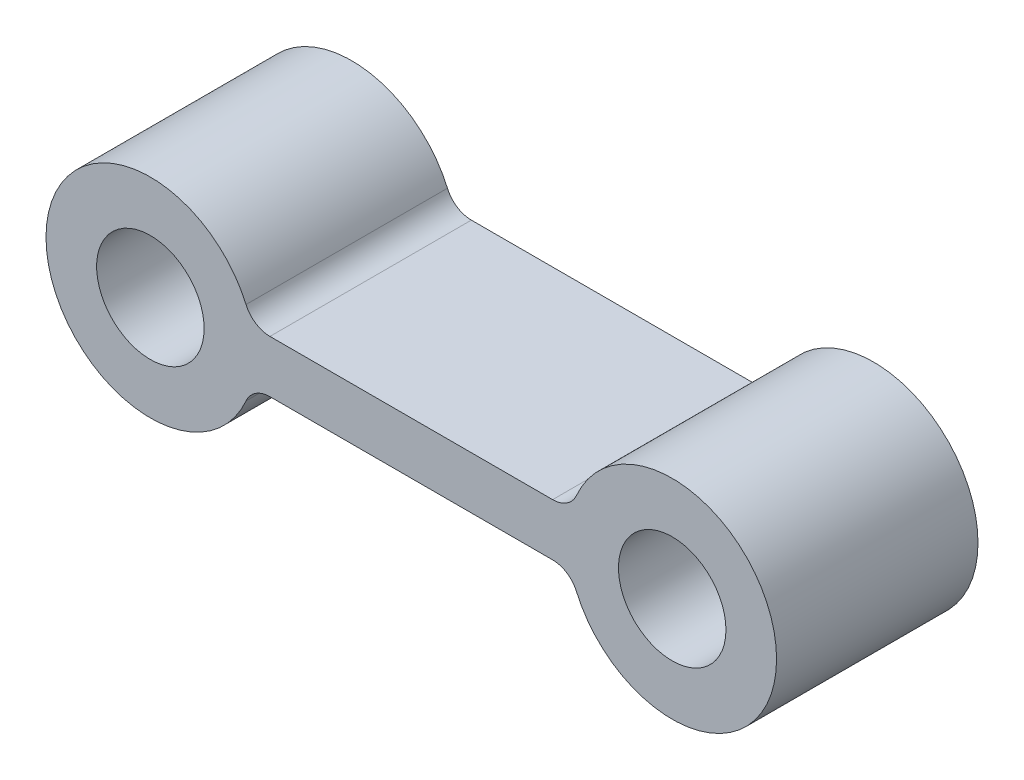
ISO-10303-21;
HEADER;
FILE_DESCRIPTION(('STEP AP214'),'2;1');
FILE_NAME('part.step','',(''),(''),'','','');
FILE_SCHEMA(('AUTOMOTIVE_DESIGN { 1 0 10303 214 1 1 1 1 }'));
ENDSEC;
DATA;
#1=APPLICATION_CONTEXT('core data for automotive mechanical design processes');
#2=APPLICATION_PROTOCOL_DEFINITION('international standard','automotive_design',2000,#1);
#3=PRODUCT_CONTEXT('',#1,'mechanical');
#4=PRODUCT('Part','Part','',(#3));
#5=PRODUCT_RELATED_PRODUCT_CATEGORY('part','',(#4));
#6=PRODUCT_DEFINITION_FORMATION('','',#4);
#7=PRODUCT_DEFINITION_CONTEXT('part definition',#1,'design');
#8=PRODUCT_DEFINITION('design','',#6,#7);
#9=PRODUCT_DEFINITION_SHAPE('','',#8);
#10=(LENGTH_UNIT() NAMED_UNIT(*) SI_UNIT(.MILLI.,.METRE.));
#11=(NAMED_UNIT(*) PLANE_ANGLE_UNIT() SI_UNIT($,.RADIAN.));
#12=(NAMED_UNIT(*) SI_UNIT($,.STERADIAN.) SOLID_ANGLE_UNIT());
#13=UNCERTAINTY_MEASURE_WITH_UNIT(LENGTH_MEASURE(1.E-05),#10,'distance_accuracy_value','');
#14=(GEOMETRIC_REPRESENTATION_CONTEXT(3) GLOBAL_UNCERTAINTY_ASSIGNED_CONTEXT((#13)) GLOBAL_UNIT_ASSIGNED_CONTEXT((#10,
#11,#12)) REPRESENTATION_CONTEXT('',''));
#15=CARTESIAN_POINT('',(0.,0.,0.));
#16=DIRECTION('',(0.,0.,1.));
#17=DIRECTION('',(1.,0.,0.));
#18=AXIS2_PLACEMENT_3D('',#15,#16,#17);
#19=CARTESIAN_POINT('',(17.2003221685152,-6.35,24.511));
#20=DIRECTION('',(0.,0.,-1.));
#21=DIRECTION('',(-1.,0.,0.));
#22=AXIS2_PLACEMENT_3D('',#19,#20,#21);
#23=PLANE('',#22);
#24=CARTESIAN_POINT('',(31.75,0.,24.511));
#25=DIRECTION('',(0.,0.,1.));
#26=DIRECTION('',(1.,0.,0.));
#27=AXIS2_PLACEMENT_3D('',#24,#25,#26);
#28=CIRCLE('',#27,6.5405);
#29=CARTESIAN_POINT('',(38.2905,0.,24.511));
#30=VERTEX_POINT('',#29);
#31=EDGE_CURVE('E122',#30,#30,#28,.T.);
#32=ORIENTED_EDGE('',*,*,#31,.F.);
#33=EDGE_LOOP('',(#32));
#34=FACE_BOUND('',#33,.T.);
#35=CARTESIAN_POINT('',(17.2003221685152,-6.35,24.511));
#36=DIRECTION('',(0.,0.,-1.));
#37=DIRECTION('',(-1.,0.,0.));
#38=AXIS2_PLACEMENT_3D('',#35,#36,#37);
#39=CIRCLE('',#38,3.175);
#40=CARTESIAN_POINT('',(17.2003221685152,-3.175,24.511));
#41=VERTEX_POINT('',#40);
#42=CARTESIAN_POINT('',(20.1102577348122,-5.08,24.511));
#43=VERTEX_POINT('',#42);
#44=EDGE_CURVE('E140',#41,#43,#39,.T.);
#45=ORIENTED_EDGE('',*,*,#44,.T.);
#46=CARTESIAN_POINT('',(31.75,0.,24.511));
#47=DIRECTION('',(0.,0.,1.));
#48=DIRECTION('',(1.,0.,0.));
#49=AXIS2_PLACEMENT_3D('',#46,#47,#48);
#50=CIRCLE('',#49,12.7);
#51=CARTESIAN_POINT('',(20.1102577348122,5.08,24.511));
#52=VERTEX_POINT('',#51);
#53=EDGE_CURVE('E117',#43,#52,#50,.T.);
#54=ORIENTED_EDGE('',*,*,#53,.T.);
#55=CARTESIAN_POINT('',(17.2003221685152,6.35,24.511));
#56=DIRECTION('',(0.,0.,-1.));
#57=DIRECTION('',(1.,0.,0.));
#58=AXIS2_PLACEMENT_3D('',#55,#56,#57);
#59=CIRCLE('',#58,3.175);
#60=CARTESIAN_POINT('',(17.2003221685152,3.175,24.511));
#61=VERTEX_POINT('',#60);
#62=EDGE_CURVE('E143',#52,#61,#59,.T.);
#63=ORIENTED_EDGE('',*,*,#62,.T.);
#64=DIRECTION('',(-1.,0.,0.));
#65=VECTOR('',#64,1.);
#66=CARTESIAN_POINT('',(17.2003221685152,3.175,24.511));
#67=LINE('',#66,#65);
#68=CARTESIAN_POINT('',(-17.2003221685152,3.175,24.511));
#69=VERTEX_POINT('',#68);
#70=EDGE_CURVE('E145',#61,#69,#67,.T.);
#71=ORIENTED_EDGE('',*,*,#70,.T.);
#72=CARTESIAN_POINT('',(-17.2003221685152,6.35,24.511));
#73=DIRECTION('',(0.,0.,-1.));
#74=DIRECTION('',(-1.,0.,0.));
#75=AXIS2_PLACEMENT_3D('',#72,#73,#74);
#76=CIRCLE('',#75,3.175);
#77=CARTESIAN_POINT('',(-20.1102577348122,5.08,24.511));
#78=VERTEX_POINT('',#77);
#79=EDGE_CURVE('E147',#69,#78,#76,.T.);
#80=ORIENTED_EDGE('',*,*,#79,.T.);
#81=CARTESIAN_POINT('',(-31.75,0.,24.511));
#82=DIRECTION('',(0.,0.,1.));
#83=DIRECTION('',(1.,0.,0.));
#84=AXIS2_PLACEMENT_3D('',#81,#82,#83);
#85=CIRCLE('',#84,12.7);
#86=CARTESIAN_POINT('',(-20.1102577348122,-5.08,24.511));
#87=VERTEX_POINT('',#86);
#88=EDGE_CURVE('E149',#78,#87,#85,.T.);
#89=ORIENTED_EDGE('',*,*,#88,.T.);
#90=CARTESIAN_POINT('',(-17.2003221685152,-6.35,24.511));
#91=DIRECTION('',(0.,0.,-1.));
#92=DIRECTION('',(1.,0.,0.));
#93=AXIS2_PLACEMENT_3D('',#90,#91,#92);
#94=CIRCLE('',#93,3.175);
#95=CARTESIAN_POINT('',(-17.2003221685152,-3.175,24.511));
#96=VERTEX_POINT('',#95);
#97=EDGE_CURVE('E58',#87,#96,#94,.T.);
#98=ORIENTED_EDGE('',*,*,#97,.T.);
#99=DIRECTION('',(1.,0.,0.));
#100=VECTOR('',#99,1.);
#101=CARTESIAN_POINT('',(17.2003221685152,-3.175,24.511));
#102=LINE('',#101,#100);
#103=EDGE_CURVE('E53',#96,#41,#102,.T.);
#104=ORIENTED_EDGE('',*,*,#103,.T.);
#105=EDGE_LOOP('',(#45,#54,#63,#71,#80,#89,#98,#104));
#106=FACE_BOUND('',#105,.T.);
#107=CARTESIAN_POINT('',(-31.75,0.,24.511));
#108=DIRECTION('',(0.,0.,1.));
#109=DIRECTION('',(1.,0.,0.));
#110=AXIS2_PLACEMENT_3D('',#107,#108,#109);
#111=CIRCLE('',#110,6.5405);
#112=CARTESIAN_POINT('',(-25.2095,0.,24.511));
#113=VERTEX_POINT('',#112);
#114=EDGE_CURVE('E220',#113,#113,#111,.T.);
#115=ORIENTED_EDGE('',*,*,#114,.F.);
#116=EDGE_LOOP('',(#115));
#117=FACE_BOUND('',#116,.T.);
#118=ADVANCED_FACE('F38',(#34,#106,#117),#23,.F.);
#119=CARTESIAN_POINT('',(17.2003221685152,-6.35,0.));
#120=DIRECTION('',(0.,0.,-1.));
#121=DIRECTION('',(-1.,0.,0.));
#122=AXIS2_PLACEMENT_3D('',#119,#120,#121);
#123=PLANE('',#122);
#124=CARTESIAN_POINT('',(31.75,0.,0.));
#125=DIRECTION('',(0.,0.,1.));
#126=DIRECTION('',(1.,0.,0.));
#127=AXIS2_PLACEMENT_3D('',#124,#125,#126);
#128=CIRCLE('',#127,6.5405);
#129=CARTESIAN_POINT('',(38.2905,0.,0.));
#130=VERTEX_POINT('',#129);
#131=EDGE_CURVE('E125',#130,#130,#128,.T.);
#132=ORIENTED_EDGE('',*,*,#131,.T.);
#133=EDGE_LOOP('',(#132));
#134=FACE_BOUND('',#133,.T.);
#135=CARTESIAN_POINT('',(17.2003221685152,-6.35,0.));
#136=DIRECTION('',(0.,0.,-1.));
#137=DIRECTION('',(-1.,0.,0.));
#138=AXIS2_PLACEMENT_3D('',#135,#136,#137);
#139=CIRCLE('',#138,3.175);
#140=CARTESIAN_POINT('',(17.2003221685152,-3.175,0.));
#141=VERTEX_POINT('',#140);
#142=CARTESIAN_POINT('',(20.1102577348122,-5.08,0.));
#143=VERTEX_POINT('',#142);
#144=EDGE_CURVE('E108',#141,#143,#139,.T.);
#145=ORIENTED_EDGE('',*,*,#144,.F.);
#146=DIRECTION('',(1.,0.,0.));
#147=VECTOR('',#146,1.);
#148=CARTESIAN_POINT('',(17.2003221685152,-3.175,0.));
#149=LINE('',#148,#147);
#150=CARTESIAN_POINT('',(-17.2003221685152,-3.175,0.));
#151=VERTEX_POINT('',#150);
#152=EDGE_CURVE('E138',#151,#141,#149,.T.);
#153=ORIENTED_EDGE('',*,*,#152,.F.);
#154=CARTESIAN_POINT('',(-17.2003221685152,-6.35,0.));
#155=DIRECTION('',(0.,0.,-1.));
#156=DIRECTION('',(1.,0.,0.));
#157=AXIS2_PLACEMENT_3D('',#154,#155,#156);
#158=CIRCLE('',#157,3.175);
#159=CARTESIAN_POINT('',(-20.1102577348122,-5.08,0.));
#160=VERTEX_POINT('',#159);
#161=EDGE_CURVE('E136',#160,#151,#158,.T.);
#162=ORIENTED_EDGE('',*,*,#161,.F.);
#163=CARTESIAN_POINT('',(-31.75,0.,0.));
#164=DIRECTION('',(0.,0.,1.));
#165=DIRECTION('',(1.,0.,0.));
#166=AXIS2_PLACEMENT_3D('',#163,#164,#165);
#167=CIRCLE('',#166,12.7);
#168=CARTESIAN_POINT('',(-20.1102577348122,5.08,0.));
#169=VERTEX_POINT('',#168);
#170=EDGE_CURVE('E134',#169,#160,#167,.T.);
#171=ORIENTED_EDGE('',*,*,#170,.F.);
#172=CARTESIAN_POINT('',(-17.2003221685152,6.35,0.));
#173=DIRECTION('',(0.,0.,-1.));
#174=DIRECTION('',(-1.,0.,0.));
#175=AXIS2_PLACEMENT_3D('',#172,#173,#174);
#176=CIRCLE('',#175,3.175);
#177=CARTESIAN_POINT('',(-17.2003221685152,3.175,0.));
#178=VERTEX_POINT('',#177);
#179=EDGE_CURVE('E132',#178,#169,#176,.T.);
#180=ORIENTED_EDGE('',*,*,#179,.F.);
#181=DIRECTION('',(-1.,0.,0.));
#182=VECTOR('',#181,1.);
#183=CARTESIAN_POINT('',(17.2003221685152,3.175,0.));
#184=LINE('',#183,#182);
#185=CARTESIAN_POINT('',(17.2003221685152,3.175,0.));
#186=VERTEX_POINT('',#185);
#187=EDGE_CURVE('E130',#186,#178,#184,.T.);
#188=ORIENTED_EDGE('',*,*,#187,.F.);
#189=CARTESIAN_POINT('',(17.2003221685152,6.35,0.));
#190=DIRECTION('',(0.,0.,-1.));
#191=DIRECTION('',(1.,0.,0.));
#192=AXIS2_PLACEMENT_3D('',#189,#190,#191);
#193=CIRCLE('',#192,3.175);
#194=CARTESIAN_POINT('',(20.1102577348122,5.08,0.));
#195=VERTEX_POINT('',#194);
#196=EDGE_CURVE('E110',#195,#186,#193,.T.);
#197=ORIENTED_EDGE('',*,*,#196,.F.);
#198=CARTESIAN_POINT('',(31.75,0.,0.));
#199=DIRECTION('',(0.,0.,1.));
#200=DIRECTION('',(1.,0.,0.));
#201=AXIS2_PLACEMENT_3D('',#198,#199,#200);
#202=CIRCLE('',#201,12.7);
#203=EDGE_CURVE('E103',#143,#195,#202,.T.);
#204=ORIENTED_EDGE('',*,*,#203,.F.);
#205=EDGE_LOOP('',(#145,#153,#162,#171,#180,#188,#197,#204));
#206=FACE_BOUND('',#205,.T.);
#207=CARTESIAN_POINT('',(-31.75,0.,0.));
#208=DIRECTION('',(0.,0.,1.));
#209=DIRECTION('',(1.,0.,0.));
#210=AXIS2_PLACEMENT_3D('',#207,#208,#209);
#211=CIRCLE('',#210,6.5405);
#212=CARTESIAN_POINT('',(-25.2095,0.,0.));
#213=VERTEX_POINT('',#212);
#214=EDGE_CURVE('E223',#213,#213,#211,.T.);
#215=ORIENTED_EDGE('',*,*,#214,.T.);
#216=EDGE_LOOP('',(#215));
#217=FACE_BOUND('',#216,.T.);
#218=ADVANCED_FACE('F104',(#134,#206,#217),#123,.T.);
#219=CARTESIAN_POINT('',(17.2003221685152,-6.35,24.511));
#220=DIRECTION('',(0.,0.,-1.));
#221=DIRECTION('',(-1.,0.,0.));
#222=AXIS2_PLACEMENT_3D('',#219,#220,#221);
#223=CYLINDRICAL_SURFACE('',#222,3.175);
#224=ORIENTED_EDGE('',*,*,#144,.T.);
#225=DIRECTION('',(0.,0.,-1.));
#226=VECTOR('',#225,1.);
#227=CARTESIAN_POINT('',(20.1102577348122,-5.08,24.511));
#228=LINE('',#227,#226);
#229=EDGE_CURVE('E11',#43,#143,#228,.T.);
#230=ORIENTED_EDGE('',*,*,#229,.F.);
#231=ORIENTED_EDGE('',*,*,#44,.F.);
#232=DIRECTION('',(0.,0.,-1.));
#233=VECTOR('',#232,1.);
#234=CARTESIAN_POINT('',(17.2003221685152,-3.175,24.511));
#235=LINE('',#234,#233);
#236=EDGE_CURVE('E121',#41,#141,#235,.T.);
#237=ORIENTED_EDGE('',*,*,#236,.T.);
#238=EDGE_LOOP('',(#224,#230,#231,#237));
#239=FACE_BOUND('',#238,.T.);
#240=ADVANCED_FACE('F40',(#239),#223,.F.);
#241=CARTESIAN_POINT('',(31.75,0.,24.511));
#242=DIRECTION('',(0.,0.,-1.));
#243=DIRECTION('',(-1.,0.,0.));
#244=AXIS2_PLACEMENT_3D('',#241,#242,#243);
#245=CYLINDRICAL_SURFACE('',#244,12.7);
#246=ORIENTED_EDGE('',*,*,#203,.T.);
#247=DIRECTION('',(0.,0.,-1.));
#248=VECTOR('',#247,1.);
#249=CARTESIAN_POINT('',(20.1102577348122,5.08,24.511));
#250=LINE('',#249,#248);
#251=EDGE_CURVE('E46',#52,#195,#250,.T.);
#252=ORIENTED_EDGE('',*,*,#251,.F.);
#253=ORIENTED_EDGE('',*,*,#53,.F.);
#254=ORIENTED_EDGE('',*,*,#229,.T.);
#255=EDGE_LOOP('',(#246,#252,#253,#254));
#256=FACE_BOUND('',#255,.T.);
#257=ADVANCED_FACE('F116',(#256),#245,.T.);
#258=CARTESIAN_POINT('',(17.2003221685152,6.35,24.511));
#259=DIRECTION('',(0.,0.,-1.));
#260=DIRECTION('',(-1.,0.,0.));
#261=AXIS2_PLACEMENT_3D('',#258,#259,#260);
#262=CYLINDRICAL_SURFACE('',#261,3.175);
#263=ORIENTED_EDGE('',*,*,#196,.T.);
#264=DIRECTION('',(0.,0.,-1.));
#265=VECTOR('',#264,1.);
#266=CARTESIAN_POINT('',(17.2003221685152,3.175,24.511));
#267=LINE('',#266,#265);
#268=EDGE_CURVE('E166',#61,#186,#267,.T.);
#269=ORIENTED_EDGE('',*,*,#268,.F.);
#270=ORIENTED_EDGE('',*,*,#62,.F.);
#271=ORIENTED_EDGE('',*,*,#251,.T.);
#272=EDGE_LOOP('',(#263,#269,#270,#271));
#273=FACE_BOUND('',#272,.T.);
#274=ADVANCED_FACE('F170',(#273),#262,.F.);
#275=CARTESIAN_POINT('',(17.2003221685152,3.175,24.511));
#276=DIRECTION('',(0.,-1.,0.));
#277=DIRECTION('',(1.,0.,0.));
#278=AXIS2_PLACEMENT_3D('',#275,#276,#277);
#279=PLANE('',#278);
#280=ORIENTED_EDGE('',*,*,#187,.T.);
#281=DIRECTION('',(0.,0.,-1.));
#282=VECTOR('',#281,1.);
#283=CARTESIAN_POINT('',(-17.2003221685152,3.175,24.511));
#284=LINE('',#283,#282);
#285=EDGE_CURVE('E163',#69,#178,#284,.T.);
#286=ORIENTED_EDGE('',*,*,#285,.F.);
#287=ORIENTED_EDGE('',*,*,#70,.F.);
#288=ORIENTED_EDGE('',*,*,#268,.T.);
#289=EDGE_LOOP('',(#280,#286,#287,#288));
#290=FACE_BOUND('',#289,.T.);
#291=ADVANCED_FACE('F178',(#290),#279,.F.);
#292=CARTESIAN_POINT('',(-17.2003221685152,6.35,24.511));
#293=DIRECTION('',(0.,0.,-1.));
#294=DIRECTION('',(-1.,0.,0.));
#295=AXIS2_PLACEMENT_3D('',#292,#293,#294);
#296=CYLINDRICAL_SURFACE('',#295,3.175);
#297=ORIENTED_EDGE('',*,*,#179,.T.);
#298=DIRECTION('',(0.,0.,-1.));
#299=VECTOR('',#298,1.);
#300=CARTESIAN_POINT('',(-20.1102577348122,5.08,24.511));
#301=LINE('',#300,#299);
#302=EDGE_CURVE('E160',#78,#169,#301,.T.);
#303=ORIENTED_EDGE('',*,*,#302,.F.);
#304=ORIENTED_EDGE('',*,*,#79,.F.);
#305=ORIENTED_EDGE('',*,*,#285,.T.);
#306=EDGE_LOOP('',(#297,#303,#304,#305));
#307=FACE_BOUND('',#306,.T.);
#308=ADVANCED_FACE('F181',(#307),#296,.F.);
#309=CARTESIAN_POINT('',(-31.75,0.,24.511));
#310=DIRECTION('',(0.,0.,-1.));
#311=DIRECTION('',(-1.,0.,0.));
#312=AXIS2_PLACEMENT_3D('',#309,#310,#311);
#313=CYLINDRICAL_SURFACE('',#312,12.7);
#314=ORIENTED_EDGE('',*,*,#170,.T.);
#315=DIRECTION('',(0.,0.,-1.));
#316=VECTOR('',#315,1.);
#317=CARTESIAN_POINT('',(-20.1102577348122,-5.08,24.511));
#318=LINE('',#317,#316);
#319=EDGE_CURVE('E157',#87,#160,#318,.T.);
#320=ORIENTED_EDGE('',*,*,#319,.F.);
#321=ORIENTED_EDGE('',*,*,#88,.F.);
#322=ORIENTED_EDGE('',*,*,#302,.T.);
#323=EDGE_LOOP('',(#314,#320,#321,#322));
#324=FACE_BOUND('',#323,.T.);
#325=ADVANCED_FACE('F186',(#324),#313,.T.);
#326=CARTESIAN_POINT('',(-17.2003221685152,-6.35,24.511));
#327=DIRECTION('',(0.,0.,-1.));
#328=DIRECTION('',(-1.,0.,0.));
#329=AXIS2_PLACEMENT_3D('',#326,#327,#328);
#330=CYLINDRICAL_SURFACE('',#329,3.175);
#331=ORIENTED_EDGE('',*,*,#161,.T.);
#332=DIRECTION('',(0.,0.,-1.));
#333=VECTOR('',#332,1.);
#334=CARTESIAN_POINT('',(-17.2003221685152,-3.175,24.511));
#335=LINE('',#334,#333);
#336=EDGE_CURVE('E154',#96,#151,#335,.T.);
#337=ORIENTED_EDGE('',*,*,#336,.F.);
#338=ORIENTED_EDGE('',*,*,#97,.F.);
#339=ORIENTED_EDGE('',*,*,#319,.T.);
#340=EDGE_LOOP('',(#331,#337,#338,#339));
#341=FACE_BOUND('',#340,.T.);
#342=ADVANCED_FACE('F189',(#341),#330,.F.);
#343=CARTESIAN_POINT('',(17.2003221685152,-3.175,24.511));
#344=DIRECTION('',(0.,1.,0.));
#345=DIRECTION('',(-1.,0.,0.));
#346=AXIS2_PLACEMENT_3D('',#343,#344,#345);
#347=PLANE('',#346);
#348=ORIENTED_EDGE('',*,*,#152,.T.);
#349=ORIENTED_EDGE('',*,*,#236,.F.);
#350=ORIENTED_EDGE('',*,*,#103,.F.);
#351=ORIENTED_EDGE('',*,*,#336,.T.);
#352=EDGE_LOOP('',(#348,#349,#350,#351));
#353=FACE_BOUND('',#352,.T.);
#354=ADVANCED_FACE('F191',(#353),#347,.F.);
#355=CARTESIAN_POINT('',(31.75,0.,24.511));
#356=DIRECTION('',(0.,0.,-1.));
#357=DIRECTION('',(-1.,0.,0.));
#358=AXIS2_PLACEMENT_3D('',#355,#356,#357);
#359=CYLINDRICAL_SURFACE('',#358,6.5405);
#360=ORIENTED_EDGE('',*,*,#31,.T.);
#361=EDGE_LOOP('',(#360));
#362=FACE_BOUND('',#361,.T.);
#363=ORIENTED_EDGE('',*,*,#131,.F.);
#364=EDGE_LOOP('',(#363));
#365=FACE_BOUND('',#364,.T.);
#366=ADVANCED_FACE('F193',(#362,#365),#359,.F.);
#367=CARTESIAN_POINT('',(-31.75,0.,24.511));
#368=DIRECTION('',(0.,0.,-1.));
#369=DIRECTION('',(-1.,0.,0.));
#370=AXIS2_PLACEMENT_3D('',#367,#368,#369);
#371=CYLINDRICAL_SURFACE('',#370,6.5405);
#372=ORIENTED_EDGE('',*,*,#114,.T.);
#373=EDGE_LOOP('',(#372));
#374=FACE_BOUND('',#373,.T.);
#375=ORIENTED_EDGE('',*,*,#214,.F.);
#376=EDGE_LOOP('',(#375));
#377=FACE_BOUND('',#376,.T.);
#378=ADVANCED_FACE('F199',(#374,#377),#371,.F.);
#379=CLOSED_SHELL('',(#118,#218,#240,#257,#274,#291,#308,#325,#342,#354,#366,#378));
#380=MANIFOLD_SOLID_BREP('B2',#379);
#381=ADVANCED_BREP_SHAPE_REPRESENTATION('',(#18,#380),#14);
#382=SHAPE_DEFINITION_REPRESENTATION(#9,#381);
ENDSEC;
END-ISO-10303-21;
